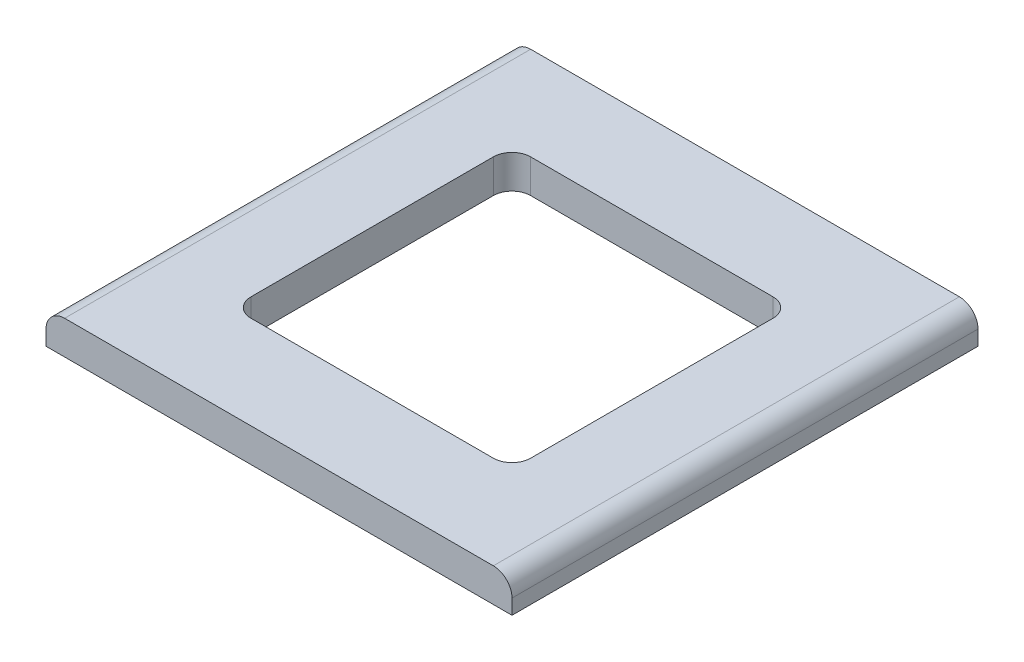
ISO-10303-21;
HEADER;
FILE_DESCRIPTION(('STEP AP214'),'2;1');
FILE_NAME('part.step','',(''),(''),'','','');
FILE_SCHEMA(('AUTOMOTIVE_DESIGN { 1 0 10303 214 1 1 1 1 }'));
ENDSEC;
DATA;
#1=APPLICATION_CONTEXT('core data for automotive mechanical design processes');
#2=APPLICATION_PROTOCOL_DEFINITION('international standard','automotive_design',2000,#1);
#3=PRODUCT_CONTEXT('',#1,'mechanical');
#4=PRODUCT('Part','Part','',(#3));
#5=PRODUCT_RELATED_PRODUCT_CATEGORY('part','',(#4));
#6=PRODUCT_DEFINITION_FORMATION('','',#4);
#7=PRODUCT_DEFINITION_CONTEXT('part definition',#1,'design');
#8=PRODUCT_DEFINITION('design','',#6,#7);
#9=PRODUCT_DEFINITION_SHAPE('','',#8);
#10=(LENGTH_UNIT() NAMED_UNIT(*) SI_UNIT(.MILLI.,.METRE.));
#11=(NAMED_UNIT(*) PLANE_ANGLE_UNIT() SI_UNIT($,.RADIAN.));
#12=(NAMED_UNIT(*) SI_UNIT($,.STERADIAN.) SOLID_ANGLE_UNIT());
#13=UNCERTAINTY_MEASURE_WITH_UNIT(LENGTH_MEASURE(1.E-05),#10,'distance_accuracy_value','');
#14=(GEOMETRIC_REPRESENTATION_CONTEXT(3) GLOBAL_UNCERTAINTY_ASSIGNED_CONTEXT((#13)) GLOBAL_UNIT_ASSIGNED_CONTEXT((#10,
#11,#12)) REPRESENTATION_CONTEXT('',''));
#15=CARTESIAN_POINT('',(0.,0.,0.));
#16=DIRECTION('',(0.,0.,1.));
#17=DIRECTION('',(1.,0.,0.));
#18=AXIS2_PLACEMENT_3D('',#15,#16,#17);
#19=CARTESIAN_POINT('',(0.,18.,0.));
#20=DIRECTION('',(0.,-1.,0.));
#21=DIRECTION('',(0.,0.,-1.));
#22=AXIS2_PLACEMENT_3D('',#19,#20,#21);
#23=PLANE('',#22);
#24=DIRECTION('',(-1.,0.,0.));
#25=VECTOR('',#24,1.);
#26=CARTESIAN_POINT('',(-125.,18.,-125.));
#27=LINE('',#26,#25);
#28=CARTESIAN_POINT('',(115.,18.,-125.));
#29=VERTEX_POINT('',#28);
#30=CARTESIAN_POINT('',(-115.,18.,-125.));
#31=VERTEX_POINT('',#30);
#32=EDGE_CURVE('E172',#29,#31,#27,.T.);
#33=ORIENTED_EDGE('',*,*,#32,.T.);
#34=DIRECTION('',(0.,0.,1.));
#35=VECTOR('',#34,1.);
#36=CARTESIAN_POINT('',(-115.,18.,0.));
#37=LINE('',#36,#35);
#38=CARTESIAN_POINT('',(-115.,18.,125.));
#39=VERTEX_POINT('',#38);
#40=EDGE_CURVE('E185',#31,#39,#37,.T.);
#41=ORIENTED_EDGE('',*,*,#40,.T.);
#42=DIRECTION('',(1.,0.,0.));
#43=VECTOR('',#42,1.);
#44=CARTESIAN_POINT('',(-125.,18.,125.));
#45=LINE('',#44,#43);
#46=CARTESIAN_POINT('',(115.,18.,125.));
#47=VERTEX_POINT('',#46);
#48=EDGE_CURVE('E178',#39,#47,#45,.T.);
#49=ORIENTED_EDGE('',*,*,#48,.T.);
#50=DIRECTION('',(0.,0.,-1.));
#51=VECTOR('',#50,1.);
#52=CARTESIAN_POINT('',(115.,18.,0.));
#53=LINE('',#52,#51);
#54=EDGE_CURVE('E151',#47,#29,#53,.T.);
#55=ORIENTED_EDGE('',*,*,#54,.T.);
#56=EDGE_LOOP('',(#33,#41,#49,#55));
#57=FACE_BOUND('',#56,.T.);
#58=DIRECTION('',(0.,0.,1.));
#59=VECTOR('',#58,1.);
#60=CARTESIAN_POINT('',(-75.,18.,-75.));
#61=LINE('',#60,#59);
#62=CARTESIAN_POINT('',(-75.,18.,-65.));
#63=VERTEX_POINT('',#62);
#64=CARTESIAN_POINT('',(-75.,18.,65.));
#65=VERTEX_POINT('',#64);
#66=EDGE_CURVE('E258',#63,#65,#61,.T.);
#67=ORIENTED_EDGE('',*,*,#66,.F.);
#68=CARTESIAN_POINT('',(-65.,18.,-65.));
#69=DIRECTION('',(0.,-1.,0.));
#70=DIRECTION('',(0.,0.,-1.));
#71=AXIS2_PLACEMENT_3D('',#68,#69,#70);
#72=CIRCLE('',#71,10.);
#73=CARTESIAN_POINT('',(-65.,18.,-75.));
#74=VERTEX_POINT('',#73);
#75=EDGE_CURVE('E11',#63,#74,#72,.T.);
#76=ORIENTED_EDGE('',*,*,#75,.T.);
#77=DIRECTION('',(-1.,0.,0.));
#78=VECTOR('',#77,1.);
#79=CARTESIAN_POINT('',(-75.,18.,-75.));
#80=LINE('',#79,#78);
#81=CARTESIAN_POINT('',(65.,18.,-75.));
#82=VERTEX_POINT('',#81);
#83=EDGE_CURVE('E167',#82,#74,#80,.T.);
#84=ORIENTED_EDGE('',*,*,#83,.F.);
#85=CARTESIAN_POINT('',(65.,18.,-65.));
#86=DIRECTION('',(0.,-1.,0.));
#87=DIRECTION('',(0.,0.,-1.));
#88=AXIS2_PLACEMENT_3D('',#85,#86,#87);
#89=CIRCLE('',#88,10.);
#90=CARTESIAN_POINT('',(75.,18.,-65.));
#91=VERTEX_POINT('',#90);
#92=EDGE_CURVE('E228',#82,#91,#89,.T.);
#93=ORIENTED_EDGE('',*,*,#92,.T.);
#94=DIRECTION('',(0.,0.,-1.));
#95=VECTOR('',#94,1.);
#96=CARTESIAN_POINT('',(75.,18.,-75.));
#97=LINE('',#96,#95);
#98=CARTESIAN_POINT('',(75.,18.,65.));
#99=VERTEX_POINT('',#98);
#100=EDGE_CURVE('E169',#99,#91,#97,.T.);
#101=ORIENTED_EDGE('',*,*,#100,.F.);
#102=CARTESIAN_POINT('',(65.,18.,65.));
#103=DIRECTION('',(0.,-1.,0.));
#104=DIRECTION('',(0.,0.,-1.));
#105=AXIS2_PLACEMENT_3D('',#102,#103,#104);
#106=CIRCLE('',#105,10.);
#107=CARTESIAN_POINT('',(65.,18.,75.));
#108=VERTEX_POINT('',#107);
#109=EDGE_CURVE('E220',#99,#108,#106,.T.);
#110=ORIENTED_EDGE('',*,*,#109,.T.);
#111=DIRECTION('',(1.,0.,0.));
#112=VECTOR('',#111,1.);
#113=CARTESIAN_POINT('',(-75.,18.,75.));
#114=LINE('',#113,#112);
#115=CARTESIAN_POINT('',(-65.,18.,75.));
#116=VERTEX_POINT('',#115);
#117=EDGE_CURVE('E446',#116,#108,#114,.T.);
#118=ORIENTED_EDGE('',*,*,#117,.F.);
#119=CARTESIAN_POINT('',(-65.,18.,65.));
#120=DIRECTION('',(0.,-1.,0.));
#121=DIRECTION('',(0.,0.,-1.));
#122=AXIS2_PLACEMENT_3D('',#119,#120,#121);
#123=CIRCLE('',#122,10.);
#124=EDGE_CURVE('E224',#116,#65,#123,.T.);
#125=ORIENTED_EDGE('',*,*,#124,.T.);
#126=EDGE_LOOP('',(#67,#76,#84,#93,#101,#110,#118,#125));
#127=FACE_BOUND('',#126,.T.);
#128=ADVANCED_FACE('F39',(#57,#127),#23,.F.);
#129=CARTESIAN_POINT('',(0.,0.,0.));
#130=DIRECTION('',(0.,-1.,0.));
#131=DIRECTION('',(0.,0.,-1.));
#132=AXIS2_PLACEMENT_3D('',#129,#130,#131);
#133=PLANE('',#132);
#134=DIRECTION('',(0.,0.,1.));
#135=VECTOR('',#134,1.);
#136=CARTESIAN_POINT('',(-125.,0.,125.));
#137=LINE('',#136,#135);
#138=CARTESIAN_POINT('',(-125.,0.,-125.));
#139=VERTEX_POINT('',#138);
#140=CARTESIAN_POINT('',(-125.,0.,125.));
#141=VERTEX_POINT('',#140);
#142=EDGE_CURVE('E159',#139,#141,#137,.T.);
#143=ORIENTED_EDGE('',*,*,#142,.F.);
#144=DIRECTION('',(-1.,0.,0.));
#145=VECTOR('',#144,1.);
#146=CARTESIAN_POINT('',(-125.,0.,-125.));
#147=LINE('',#146,#145);
#148=CARTESIAN_POINT('',(125.,0.,-125.));
#149=VERTEX_POINT('',#148);
#150=EDGE_CURVE('E176',#149,#139,#147,.T.);
#151=ORIENTED_EDGE('',*,*,#150,.F.);
#152=DIRECTION('',(0.,0.,-1.));
#153=VECTOR('',#152,1.);
#154=CARTESIAN_POINT('',(125.,0.,125.));
#155=LINE('',#154,#153);
#156=CARTESIAN_POINT('',(125.,0.,125.));
#157=VERTEX_POINT('',#156);
#158=EDGE_CURVE('E161',#157,#149,#155,.T.);
#159=ORIENTED_EDGE('',*,*,#158,.F.);
#160=DIRECTION('',(1.,0.,0.));
#161=VECTOR('',#160,1.);
#162=CARTESIAN_POINT('',(-125.,0.,125.));
#163=LINE('',#162,#161);
#164=EDGE_CURVE('E145',#141,#157,#163,.T.);
#165=ORIENTED_EDGE('',*,*,#164,.F.);
#166=EDGE_LOOP('',(#143,#151,#159,#165));
#167=FACE_BOUND('',#166,.T.);
#168=DIRECTION('',(0.,0.,-1.));
#169=VECTOR('',#168,1.);
#170=CARTESIAN_POINT('',(75.,0.,-75.));
#171=LINE('',#170,#169);
#172=CARTESIAN_POINT('',(75.,0.,65.));
#173=VERTEX_POINT('',#172);
#174=CARTESIAN_POINT('',(75.,0.,-65.));
#175=VERTEX_POINT('',#174);
#176=EDGE_CURVE('E254',#173,#175,#171,.T.);
#177=ORIENTED_EDGE('',*,*,#176,.T.);
#178=CARTESIAN_POINT('',(65.,0.,-65.));
#179=DIRECTION('',(0.,-1.,0.));
#180=DIRECTION('',(0.,0.,-1.));
#181=AXIS2_PLACEMENT_3D('',#178,#179,#180);
#182=CIRCLE('',#181,10.);
#183=CARTESIAN_POINT('',(65.,0.,-75.));
#184=VERTEX_POINT('',#183);
#185=EDGE_CURVE('E226',#175,#184,#182,.F.);
#186=ORIENTED_EDGE('',*,*,#185,.T.);
#187=DIRECTION('',(-1.,0.,0.));
#188=VECTOR('',#187,1.);
#189=CARTESIAN_POINT('',(-75.,0.,-75.));
#190=LINE('',#189,#188);
#191=CARTESIAN_POINT('',(-65.,0.,-75.));
#192=VERTEX_POINT('',#191);
#193=EDGE_CURVE('E234',#184,#192,#190,.T.);
#194=ORIENTED_EDGE('',*,*,#193,.T.);
#195=CARTESIAN_POINT('',(-65.,0.,-65.));
#196=DIRECTION('',(0.,-1.,0.));
#197=DIRECTION('',(0.,0.,-1.));
#198=AXIS2_PLACEMENT_3D('',#195,#196,#197);
#199=CIRCLE('',#198,10.);
#200=CARTESIAN_POINT('',(-75.,0.,-65.));
#201=VERTEX_POINT('',#200);
#202=EDGE_CURVE('E47',#192,#201,#199,.F.);
#203=ORIENTED_EDGE('',*,*,#202,.T.);
#204=DIRECTION('',(0.,0.,1.));
#205=VECTOR('',#204,1.);
#206=CARTESIAN_POINT('',(-75.,0.,-75.));
#207=LINE('',#206,#205);
#208=CARTESIAN_POINT('',(-75.,0.,65.));
#209=VERTEX_POINT('',#208);
#210=EDGE_CURVE('E233',#201,#209,#207,.T.);
#211=ORIENTED_EDGE('',*,*,#210,.T.);
#212=CARTESIAN_POINT('',(-65.,0.,65.));
#213=DIRECTION('',(0.,-1.,0.));
#214=DIRECTION('',(0.,0.,-1.));
#215=AXIS2_PLACEMENT_3D('',#212,#213,#214);
#216=CIRCLE('',#215,10.);
#217=CARTESIAN_POINT('',(-65.,0.,75.));
#218=VERTEX_POINT('',#217);
#219=EDGE_CURVE('E222',#209,#218,#216,.F.);
#220=ORIENTED_EDGE('',*,*,#219,.T.);
#221=DIRECTION('',(1.,0.,0.));
#222=VECTOR('',#221,1.);
#223=CARTESIAN_POINT('',(-75.,0.,75.));
#224=LINE('',#223,#222);
#225=CARTESIAN_POINT('',(65.,0.,75.));
#226=VERTEX_POINT('',#225);
#227=EDGE_CURVE('E242',#218,#226,#224,.T.);
#228=ORIENTED_EDGE('',*,*,#227,.T.);
#229=CARTESIAN_POINT('',(65.,0.,65.));
#230=DIRECTION('',(0.,-1.,0.));
#231=DIRECTION('',(0.,0.,-1.));
#232=AXIS2_PLACEMENT_3D('',#229,#230,#231);
#233=CIRCLE('',#232,10.);
#234=EDGE_CURVE('E218',#226,#173,#233,.F.);
#235=ORIENTED_EDGE('',*,*,#234,.T.);
#236=EDGE_LOOP('',(#177,#186,#194,#203,#211,#220,#228,#235));
#237=FACE_BOUND('',#236,.T.);
#238=ADVANCED_FACE('F156',(#167,#237),#133,.T.);
#239=CARTESIAN_POINT('',(-125.,18.,125.));
#240=DIRECTION('',(1.,0.,0.));
#241=DIRECTION('',(0.,0.,-1.));
#242=AXIS2_PLACEMENT_3D('',#239,#240,#241);
#243=PLANE('',#242);
#244=DIRECTION('',(0.,-1.,0.));
#245=VECTOR('',#244,1.);
#246=CARTESIAN_POINT('',(-125.,18.,125.));
#247=LINE('',#246,#245);
#248=CARTESIAN_POINT('',(-125.,8.,125.));
#249=VERTEX_POINT('',#248);
#250=EDGE_CURVE('E140',#249,#141,#247,.T.);
#251=ORIENTED_EDGE('',*,*,#250,.F.);
#252=DIRECTION('',(0.,0.,1.));
#253=VECTOR('',#252,1.);
#254=CARTESIAN_POINT('',(-125.,8.,125.));
#255=LINE('',#254,#253);
#256=CARTESIAN_POINT('',(-125.,8.,-125.));
#257=VERTEX_POINT('',#256);
#258=EDGE_CURVE('E191',#249,#257,#255,.F.);
#259=ORIENTED_EDGE('',*,*,#258,.T.);
#260=DIRECTION('',(0.,-1.,0.));
#261=VECTOR('',#260,1.);
#262=CARTESIAN_POINT('',(-125.,18.,-125.));
#263=LINE('',#262,#261);
#264=EDGE_CURVE('E165',#257,#139,#263,.T.);
#265=ORIENTED_EDGE('',*,*,#264,.T.);
#266=ORIENTED_EDGE('',*,*,#142,.T.);
#267=EDGE_LOOP('',(#251,#259,#265,#266));
#268=FACE_BOUND('',#267,.T.);
#269=ADVANCED_FACE('F163',(#268),#243,.F.);
#270=CARTESIAN_POINT('',(-125.,18.,125.));
#271=DIRECTION('',(0.,0.,-1.));
#272=DIRECTION('',(-1.,0.,0.));
#273=AXIS2_PLACEMENT_3D('',#270,#271,#272);
#274=PLANE('',#273);
#275=ORIENTED_EDGE('',*,*,#48,.F.);
#276=CARTESIAN_POINT('',(-115.,8.,125.));
#277=DIRECTION('',(0.,0.,-1.));
#278=DIRECTION('',(-1.,0.,0.));
#279=AXIS2_PLACEMENT_3D('',#276,#277,#278);
#280=CIRCLE('',#279,10.);
#281=EDGE_CURVE('E147',#39,#249,#280,.F.);
#282=ORIENTED_EDGE('',*,*,#281,.T.);
#283=ORIENTED_EDGE('',*,*,#250,.T.);
#284=ORIENTED_EDGE('',*,*,#164,.T.);
#285=DIRECTION('',(0.,-1.,0.));
#286=VECTOR('',#285,1.);
#287=CARTESIAN_POINT('',(125.,18.,125.));
#288=LINE('',#287,#286);
#289=CARTESIAN_POINT('',(125.,8.,125.));
#290=VERTEX_POINT('',#289);
#291=EDGE_CURVE('E152',#290,#157,#288,.T.);
#292=ORIENTED_EDGE('',*,*,#291,.F.);
#293=CARTESIAN_POINT('',(115.,8.,125.));
#294=DIRECTION('',(0.,0.,-1.));
#295=DIRECTION('',(-1.,0.,0.));
#296=AXIS2_PLACEMENT_3D('',#293,#294,#295);
#297=CIRCLE('',#296,10.);
#298=EDGE_CURVE('E188',#290,#47,#297,.F.);
#299=ORIENTED_EDGE('',*,*,#298,.T.);
#300=EDGE_LOOP('',(#275,#282,#283,#284,#292,#299));
#301=FACE_BOUND('',#300,.T.);
#302=ADVANCED_FACE('F143',(#301),#274,.F.);
#303=CARTESIAN_POINT('',(125.,18.,125.));
#304=DIRECTION('',(-1.,0.,0.));
#305=DIRECTION('',(0.,0.,1.));
#306=AXIS2_PLACEMENT_3D('',#303,#304,#305);
#307=PLANE('',#306);
#308=DIRECTION('',(0.,-1.,0.));
#309=VECTOR('',#308,1.);
#310=CARTESIAN_POINT('',(125.,18.,-125.));
#311=LINE('',#310,#309);
#312=CARTESIAN_POINT('',(125.,8.,-125.));
#313=VERTEX_POINT('',#312);
#314=EDGE_CURVE('E180',#313,#149,#311,.T.);
#315=ORIENTED_EDGE('',*,*,#314,.F.);
#316=DIRECTION('',(0.,0.,-1.));
#317=VECTOR('',#316,1.);
#318=CARTESIAN_POINT('',(125.,8.,125.));
#319=LINE('',#318,#317);
#320=EDGE_CURVE('E197',#313,#290,#319,.F.);
#321=ORIENTED_EDGE('',*,*,#320,.T.);
#322=ORIENTED_EDGE('',*,*,#291,.T.);
#323=ORIENTED_EDGE('',*,*,#158,.T.);
#324=EDGE_LOOP('',(#315,#321,#322,#323));
#325=FACE_BOUND('',#324,.T.);
#326=ADVANCED_FACE('F275',(#325),#307,.F.);
#327=CARTESIAN_POINT('',(-125.,18.,-125.));
#328=DIRECTION('',(0.,0.,1.));
#329=DIRECTION('',(1.,0.,0.));
#330=AXIS2_PLACEMENT_3D('',#327,#328,#329);
#331=PLANE('',#330);
#332=ORIENTED_EDGE('',*,*,#264,.F.);
#333=CARTESIAN_POINT('',(-115.,8.,-125.));
#334=DIRECTION('',(0.,0.,1.));
#335=DIRECTION('',(1.,0.,0.));
#336=AXIS2_PLACEMENT_3D('',#333,#334,#335);
#337=CIRCLE('',#336,10.);
#338=EDGE_CURVE('E195',#257,#31,#337,.F.);
#339=ORIENTED_EDGE('',*,*,#338,.T.);
#340=ORIENTED_EDGE('',*,*,#32,.F.);
#341=CARTESIAN_POINT('',(115.,8.,-125.));
#342=DIRECTION('',(0.,0.,1.));
#343=DIRECTION('',(1.,0.,0.));
#344=AXIS2_PLACEMENT_3D('',#341,#342,#343);
#345=CIRCLE('',#344,10.);
#346=EDGE_CURVE('E193',#29,#313,#345,.F.);
#347=ORIENTED_EDGE('',*,*,#346,.T.);
#348=ORIENTED_EDGE('',*,*,#314,.T.);
#349=ORIENTED_EDGE('',*,*,#150,.T.);
#350=EDGE_LOOP('',(#332,#339,#340,#347,#348,#349));
#351=FACE_BOUND('',#350,.T.);
#352=ADVANCED_FACE('F271',(#351),#331,.F.);
#353=CARTESIAN_POINT('',(-75.,18.,-75.));
#354=DIRECTION('',(1.,0.,0.));
#355=DIRECTION('',(0.,0.,-1.));
#356=AXIS2_PLACEMENT_3D('',#353,#354,#355);
#357=PLANE('',#356);
#358=ORIENTED_EDGE('',*,*,#66,.T.);
#359=DIRECTION('',(0.,-1.,0.));
#360=VECTOR('',#359,1.);
#361=CARTESIAN_POINT('',(-75.,0.,65.));
#362=LINE('',#361,#360);
#363=EDGE_CURVE('E211',#65,#209,#362,.T.);
#364=ORIENTED_EDGE('',*,*,#363,.T.);
#365=ORIENTED_EDGE('',*,*,#210,.F.);
#366=DIRECTION('',(0.,-1.,0.));
#367=VECTOR('',#366,1.);
#368=CARTESIAN_POINT('',(-75.,18.,-65.));
#369=LINE('',#368,#367);
#370=EDGE_CURVE('E209',#201,#63,#369,.F.);
#371=ORIENTED_EDGE('',*,*,#370,.T.);
#372=EDGE_LOOP('',(#358,#364,#365,#371));
#373=FACE_BOUND('',#372,.T.);
#374=ADVANCED_FACE('F240',(#373),#357,.T.);
#375=CARTESIAN_POINT('',(-75.,18.,75.));
#376=DIRECTION('',(0.,0.,-1.));
#377=DIRECTION('',(-1.,0.,0.));
#378=AXIS2_PLACEMENT_3D('',#375,#376,#377);
#379=PLANE('',#378);
#380=ORIENTED_EDGE('',*,*,#117,.T.);
#381=DIRECTION('',(0.,-1.,0.));
#382=VECTOR('',#381,1.);
#383=CARTESIAN_POINT('',(65.,0.,75.));
#384=LINE('',#383,#382);
#385=EDGE_CURVE('E201',#108,#226,#384,.T.);
#386=ORIENTED_EDGE('',*,*,#385,.T.);
#387=ORIENTED_EDGE('',*,*,#227,.F.);
#388=DIRECTION('',(0.,-1.,0.));
#389=VECTOR('',#388,1.);
#390=CARTESIAN_POINT('',(-65.,18.,75.));
#391=LINE('',#390,#389);
#392=EDGE_CURVE('E199',#218,#116,#391,.F.);
#393=ORIENTED_EDGE('',*,*,#392,.T.);
#394=EDGE_LOOP('',(#380,#386,#387,#393));
#395=FACE_BOUND('',#394,.T.);
#396=ADVANCED_FACE('F329',(#395),#379,.T.);
#397=CARTESIAN_POINT('',(75.,18.,-75.));
#398=DIRECTION('',(-1.,0.,0.));
#399=DIRECTION('',(0.,0.,1.));
#400=AXIS2_PLACEMENT_3D('',#397,#398,#399);
#401=PLANE('',#400);
#402=ORIENTED_EDGE('',*,*,#176,.F.);
#403=DIRECTION('',(0.,-1.,0.));
#404=VECTOR('',#403,1.);
#405=CARTESIAN_POINT('',(75.,18.,65.));
#406=LINE('',#405,#404);
#407=EDGE_CURVE('E207',#173,#99,#406,.F.);
#408=ORIENTED_EDGE('',*,*,#407,.T.);
#409=ORIENTED_EDGE('',*,*,#100,.T.);
#410=DIRECTION('',(0.,-1.,0.));
#411=VECTOR('',#410,1.);
#412=CARTESIAN_POINT('',(75.,0.,-65.));
#413=LINE('',#412,#411);
#414=EDGE_CURVE('E204',#91,#175,#413,.T.);
#415=ORIENTED_EDGE('',*,*,#414,.T.);
#416=EDGE_LOOP('',(#402,#408,#409,#415));
#417=FACE_BOUND('',#416,.T.);
#418=ADVANCED_FACE('F253',(#417),#401,.T.);
#419=CARTESIAN_POINT('',(-75.,18.,-75.));
#420=DIRECTION('',(0.,0.,1.));
#421=DIRECTION('',(1.,0.,0.));
#422=AXIS2_PLACEMENT_3D('',#419,#420,#421);
#423=PLANE('',#422);
#424=ORIENTED_EDGE('',*,*,#193,.F.);
#425=DIRECTION('',(0.,-1.,0.));
#426=VECTOR('',#425,1.);
#427=CARTESIAN_POINT('',(65.,18.,-75.));
#428=LINE('',#427,#426);
#429=EDGE_CURVE('E59',#184,#82,#428,.F.);
#430=ORIENTED_EDGE('',*,*,#429,.T.);
#431=ORIENTED_EDGE('',*,*,#83,.T.);
#432=DIRECTION('',(0.,-1.,0.));
#433=VECTOR('',#432,1.);
#434=CARTESIAN_POINT('',(-65.,0.,-75.));
#435=LINE('',#434,#433);
#436=EDGE_CURVE('E214',#74,#192,#435,.T.);
#437=ORIENTED_EDGE('',*,*,#436,.T.);
#438=EDGE_LOOP('',(#424,#430,#431,#437));
#439=FACE_BOUND('',#438,.T.);
#440=ADVANCED_FACE('F244',(#439),#423,.T.);
#441=CARTESIAN_POINT('',(-115.,8.,0.));
#442=DIRECTION('',(0.,0.,1.));
#443=DIRECTION('',(1.,0.,0.));
#444=AXIS2_PLACEMENT_3D('',#441,#442,#443);
#445=CYLINDRICAL_SURFACE('',#444,10.);
#446=ORIENTED_EDGE('',*,*,#338,.F.);
#447=ORIENTED_EDGE('',*,*,#258,.F.);
#448=ORIENTED_EDGE('',*,*,#281,.F.);
#449=ORIENTED_EDGE('',*,*,#40,.F.);
#450=EDGE_LOOP('',(#446,#447,#448,#449));
#451=FACE_BOUND('',#450,.T.);
#452=ADVANCED_FACE('F270',(#451),#445,.T.);
#453=CARTESIAN_POINT('',(115.,8.,0.));
#454=DIRECTION('',(0.,0.,-1.));
#455=DIRECTION('',(-1.,0.,0.));
#456=AXIS2_PLACEMENT_3D('',#453,#454,#455);
#457=CYLINDRICAL_SURFACE('',#456,10.);
#458=ORIENTED_EDGE('',*,*,#298,.F.);
#459=ORIENTED_EDGE('',*,*,#320,.F.);
#460=ORIENTED_EDGE('',*,*,#346,.F.);
#461=ORIENTED_EDGE('',*,*,#54,.F.);
#462=EDGE_LOOP('',(#458,#459,#460,#461));
#463=FACE_BOUND('',#462,.T.);
#464=ADVANCED_FACE('F278',(#463),#457,.T.);
#465=CARTESIAN_POINT('',(65.,18.,65.));
#466=DIRECTION('',(0.,1.,0.));
#467=DIRECTION('',(0.,0.,1.));
#468=AXIS2_PLACEMENT_3D('',#465,#466,#467);
#469=CYLINDRICAL_SURFACE('',#468,10.);
#470=ORIENTED_EDGE('',*,*,#109,.F.);
#471=ORIENTED_EDGE('',*,*,#407,.F.);
#472=ORIENTED_EDGE('',*,*,#234,.F.);
#473=ORIENTED_EDGE('',*,*,#385,.F.);
#474=EDGE_LOOP('',(#470,#471,#472,#473));
#475=FACE_BOUND('',#474,.T.);
#476=ADVANCED_FACE('F280',(#475),#469,.F.);
#477=CARTESIAN_POINT('',(-65.,18.,65.));
#478=DIRECTION('',(0.,1.,0.));
#479=DIRECTION('',(0.,0.,1.));
#480=AXIS2_PLACEMENT_3D('',#477,#478,#479);
#481=CYLINDRICAL_SURFACE('',#480,10.);
#482=ORIENTED_EDGE('',*,*,#124,.F.);
#483=ORIENTED_EDGE('',*,*,#392,.F.);
#484=ORIENTED_EDGE('',*,*,#219,.F.);
#485=ORIENTED_EDGE('',*,*,#363,.F.);
#486=EDGE_LOOP('',(#482,#483,#484,#485));
#487=FACE_BOUND('',#486,.T.);
#488=ADVANCED_FACE('F286',(#487),#481,.F.);
#489=CARTESIAN_POINT('',(65.,18.,-65.));
#490=DIRECTION('',(0.,1.,0.));
#491=DIRECTION('',(0.,0.,1.));
#492=AXIS2_PLACEMENT_3D('',#489,#490,#491);
#493=CYLINDRICAL_SURFACE('',#492,10.);
#494=ORIENTED_EDGE('',*,*,#92,.F.);
#495=ORIENTED_EDGE('',*,*,#429,.F.);
#496=ORIENTED_EDGE('',*,*,#185,.F.);
#497=ORIENTED_EDGE('',*,*,#414,.F.);
#498=EDGE_LOOP('',(#494,#495,#496,#497));
#499=FACE_BOUND('',#498,.T.);
#500=ADVANCED_FACE('F250',(#499),#493,.F.);
#501=CARTESIAN_POINT('',(-65.,18.,-65.));
#502=DIRECTION('',(0.,1.,0.));
#503=DIRECTION('',(0.,0.,1.));
#504=AXIS2_PLACEMENT_3D('',#501,#502,#503);
#505=CYLINDRICAL_SURFACE('',#504,10.);
#506=ORIENTED_EDGE('',*,*,#75,.F.);
#507=ORIENTED_EDGE('',*,*,#370,.F.);
#508=ORIENTED_EDGE('',*,*,#202,.F.);
#509=ORIENTED_EDGE('',*,*,#436,.F.);
#510=EDGE_LOOP('',(#506,#507,#508,#509));
#511=FACE_BOUND('',#510,.T.);
#512=ADVANCED_FACE('F41',(#511),#505,.F.);
#513=CLOSED_SHELL('',(#128,#238,#269,#302,#326,#352,#374,#396,#418,#440,#452,#464,#476,#488,
#500,#512));
#514=MANIFOLD_SOLID_BREP('B2',#513);
#515=ADVANCED_BREP_SHAPE_REPRESENTATION('',(#18,#514),#14);
#516=SHAPE_DEFINITION_REPRESENTATION(#9,#515);
ENDSEC;
END-ISO-10303-21;
